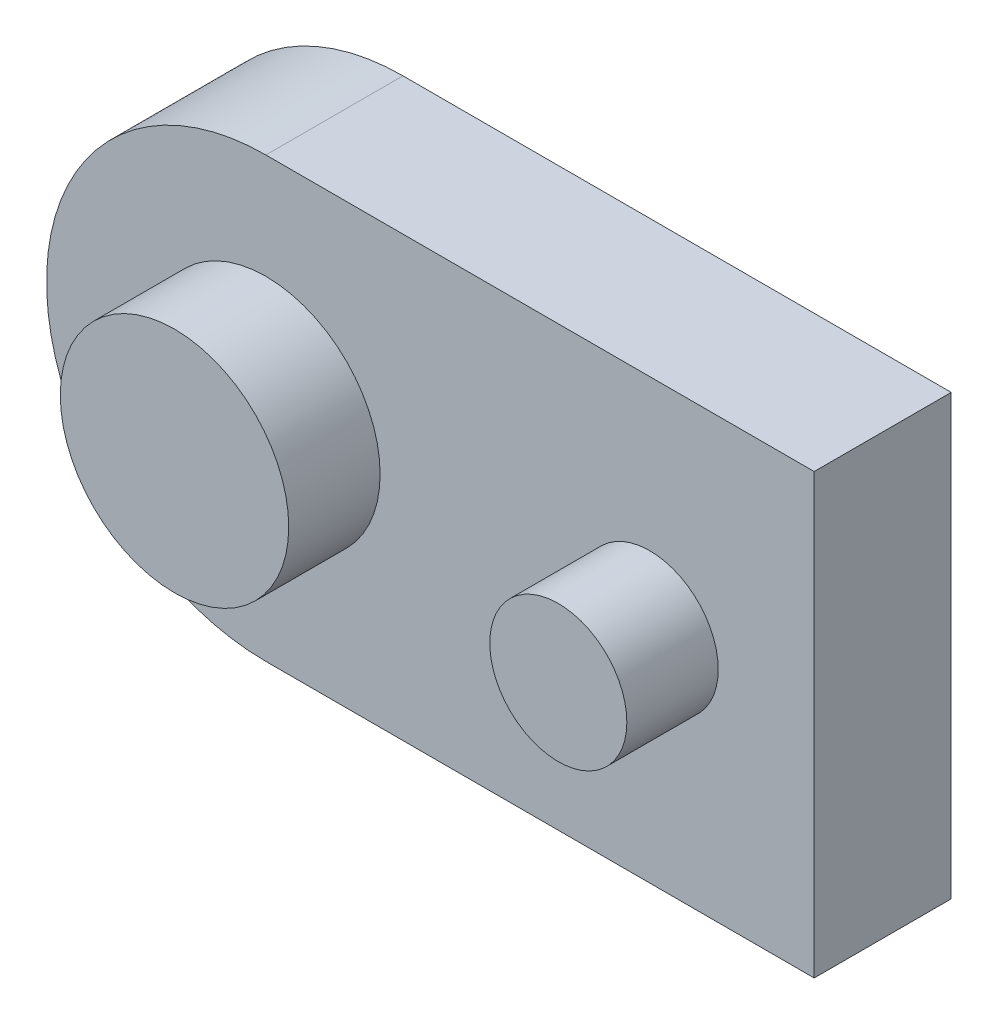
ISO-10303-21;
HEADER;
FILE_DESCRIPTION(('STEP AP214'),'2;1');
FILE_NAME('part.step','',(''),(''),'','','');
FILE_SCHEMA(('AUTOMOTIVE_DESIGN { 1 0 10303 214 1 1 1 1 }'));
ENDSEC;
DATA;
#1=APPLICATION_CONTEXT('core data for automotive mechanical design processes');
#2=APPLICATION_PROTOCOL_DEFINITION('international standard','automotive_design',2000,#1);
#3=PRODUCT_CONTEXT('',#1,'mechanical');
#4=PRODUCT('Part','Part','',(#3));
#5=PRODUCT_RELATED_PRODUCT_CATEGORY('part','',(#4));
#6=PRODUCT_DEFINITION_FORMATION('','',#4);
#7=PRODUCT_DEFINITION_CONTEXT('part definition',#1,'design');
#8=PRODUCT_DEFINITION('design','',#6,#7);
#9=PRODUCT_DEFINITION_SHAPE('','',#8);
#10=(LENGTH_UNIT() NAMED_UNIT(*) SI_UNIT(.MILLI.,.METRE.));
#11=(NAMED_UNIT(*) PLANE_ANGLE_UNIT() SI_UNIT($,.RADIAN.));
#12=(NAMED_UNIT(*) SI_UNIT($,.STERADIAN.) SOLID_ANGLE_UNIT());
#13=UNCERTAINTY_MEASURE_WITH_UNIT(LENGTH_MEASURE(1.E-05),#10,'distance_accuracy_value','');
#14=(GEOMETRIC_REPRESENTATION_CONTEXT(3) GLOBAL_UNCERTAINTY_ASSIGNED_CONTEXT((#13)) GLOBAL_UNIT_ASSIGNED_CONTEXT((#10,
#11,#12)) REPRESENTATION_CONTEXT('',''));
#15=CARTESIAN_POINT('',(0.,0.,0.));
#16=DIRECTION('',(0.,0.,1.));
#17=DIRECTION('',(1.,0.,0.));
#18=AXIS2_PLACEMENT_3D('',#15,#16,#17);
#19=CARTESIAN_POINT('',(0.,0.,3.));
#20=DIRECTION('',(0.,0.,-1.));
#21=DIRECTION('',(-1.,0.,0.));
#22=AXIS2_PLACEMENT_3D('',#19,#20,#21);
#23=CYLINDRICAL_SURFACE('',#22,4.8);
#24=CARTESIAN_POINT('',(0.,0.,0.));
#25=DIRECTION('',(0.,0.,1.));
#26=DIRECTION('',(1.,0.,0.));
#27=AXIS2_PLACEMENT_3D('',#24,#25,#26);
#28=CIRCLE('',#27,4.8);
#29=CARTESIAN_POINT('',(0.,4.8,0.));
#30=VERTEX_POINT('',#29);
#31=CARTESIAN_POINT('',(0.,-4.8,0.));
#32=VERTEX_POINT('',#31);
#33=EDGE_CURVE('E96',#30,#32,#28,.T.);
#34=ORIENTED_EDGE('',*,*,#33,.T.);
#35=DIRECTION('',(0.,0.,-1.));
#36=VECTOR('',#35,1.);
#37=CARTESIAN_POINT('',(0.,-4.8,3.));
#38=LINE('',#37,#36);
#39=CARTESIAN_POINT('',(0.,-4.8,3.));
#40=VERTEX_POINT('',#39);
#41=EDGE_CURVE('E11',#40,#32,#38,.T.);
#42=ORIENTED_EDGE('',*,*,#41,.F.);
#43=CARTESIAN_POINT('',(0.,0.,3.));
#44=DIRECTION('',(0.,0.,1.));
#45=DIRECTION('',(1.,0.,0.));
#46=AXIS2_PLACEMENT_3D('',#43,#44,#45);
#47=CIRCLE('',#46,4.8);
#48=CARTESIAN_POINT('',(0.,4.8,3.));
#49=VERTEX_POINT('',#48);
#50=EDGE_CURVE('E84',#49,#40,#47,.T.);
#51=ORIENTED_EDGE('',*,*,#50,.F.);
#52=DIRECTION('',(0.,0.,-1.));
#53=VECTOR('',#52,1.);
#54=CARTESIAN_POINT('',(0.,4.8,3.));
#55=LINE('',#54,#53);
#56=EDGE_CURVE('E92',#49,#30,#55,.T.);
#57=ORIENTED_EDGE('',*,*,#56,.T.);
#58=EDGE_LOOP('',(#34,#42,#51,#57));
#59=FACE_BOUND('',#58,.T.);
#60=ADVANCED_FACE('F33',(#59),#23,.T.);
#61=CARTESIAN_POINT('',(0.,-4.8,3.));
#62=DIRECTION('',(0.,1.,0.));
#63=DIRECTION('',(0.,0.,1.));
#64=AXIS2_PLACEMENT_3D('',#61,#62,#63);
#65=PLANE('',#64);
#66=DIRECTION('',(1.,0.,0.));
#67=VECTOR('',#66,1.);
#68=CARTESIAN_POINT('',(0.,-4.8,0.));
#69=LINE('',#68,#67);
#70=CARTESIAN_POINT('',(12.,-4.8,0.));
#71=VERTEX_POINT('',#70);
#72=EDGE_CURVE('E88',#32,#71,#69,.T.);
#73=ORIENTED_EDGE('',*,*,#72,.T.);
#74=DIRECTION('',(0.,0.,-1.));
#75=VECTOR('',#74,1.);
#76=CARTESIAN_POINT('',(12.,-4.8,3.));
#77=LINE('',#76,#75);
#78=CARTESIAN_POINT('',(12.,-4.8,3.));
#79=VERTEX_POINT('',#78);
#80=EDGE_CURVE('E41',#79,#71,#77,.T.);
#81=ORIENTED_EDGE('',*,*,#80,.F.);
#82=DIRECTION('',(1.,0.,0.));
#83=VECTOR('',#82,1.);
#84=CARTESIAN_POINT('',(0.,-4.8,3.));
#85=LINE('',#84,#83);
#86=EDGE_CURVE('E79',#40,#79,#85,.T.);
#87=ORIENTED_EDGE('',*,*,#86,.F.);
#88=ORIENTED_EDGE('',*,*,#41,.T.);
#89=EDGE_LOOP('',(#73,#81,#87,#88));
#90=FACE_BOUND('',#89,.T.);
#91=ADVANCED_FACE('F87',(#90),#65,.F.);
#92=CARTESIAN_POINT('',(12.,-4.8,3.));
#93=DIRECTION('',(-1.,0.,0.));
#94=DIRECTION('',(0.,0.,1.));
#95=AXIS2_PLACEMENT_3D('',#92,#93,#94);
#96=PLANE('',#95);
#97=DIRECTION('',(0.,1.,0.));
#98=VECTOR('',#97,1.);
#99=CARTESIAN_POINT('',(12.,-4.8,0.));
#100=LINE('',#99,#98);
#101=CARTESIAN_POINT('',(12.,4.8,0.));
#102=VERTEX_POINT('',#101);
#103=EDGE_CURVE('E66',#71,#102,#100,.T.);
#104=ORIENTED_EDGE('',*,*,#103,.T.);
#105=DIRECTION('',(0.,0.,-1.));
#106=VECTOR('',#105,1.);
#107=CARTESIAN_POINT('',(12.,4.8,3.));
#108=LINE('',#107,#106);
#109=CARTESIAN_POINT('',(12.,4.8,3.));
#110=VERTEX_POINT('',#109);
#111=EDGE_CURVE('E89',#110,#102,#108,.T.);
#112=ORIENTED_EDGE('',*,*,#111,.F.);
#113=DIRECTION('',(0.,1.,0.));
#114=VECTOR('',#113,1.);
#115=CARTESIAN_POINT('',(12.,-4.8,3.));
#116=LINE('',#115,#114);
#117=EDGE_CURVE('E82',#79,#110,#116,.T.);
#118=ORIENTED_EDGE('',*,*,#117,.F.);
#119=ORIENTED_EDGE('',*,*,#80,.T.);
#120=EDGE_LOOP('',(#104,#112,#118,#119));
#121=FACE_BOUND('',#120,.T.);
#122=ADVANCED_FACE('F90',(#121),#96,.F.);
#123=CARTESIAN_POINT('',(12.,4.8,3.));
#124=DIRECTION('',(0.,-1.,0.));
#125=DIRECTION('',(0.,0.,-1.));
#126=AXIS2_PLACEMENT_3D('',#123,#124,#125);
#127=PLANE('',#126);
#128=DIRECTION('',(-1.,0.,0.));
#129=VECTOR('',#128,1.);
#130=CARTESIAN_POINT('',(12.,4.8,0.));
#131=LINE('',#130,#129);
#132=EDGE_CURVE('E72',#102,#30,#131,.T.);
#133=ORIENTED_EDGE('',*,*,#132,.T.);
#134=ORIENTED_EDGE('',*,*,#56,.F.);
#135=DIRECTION('',(-1.,0.,0.));
#136=VECTOR('',#135,1.);
#137=CARTESIAN_POINT('',(12.,4.8,3.));
#138=LINE('',#137,#136);
#139=EDGE_CURVE('E49',#110,#49,#138,.T.);
#140=ORIENTED_EDGE('',*,*,#139,.F.);
#141=ORIENTED_EDGE('',*,*,#111,.T.);
#142=EDGE_LOOP('',(#133,#134,#140,#141));
#143=FACE_BOUND('',#142,.T.);
#144=ADVANCED_FACE('F104',(#143),#127,.F.);
#145=CARTESIAN_POINT('',(0.,0.,3.));
#146=DIRECTION('',(0.,0.,1.));
#147=DIRECTION('',(1.,0.,0.));
#148=AXIS2_PLACEMENT_3D('',#145,#146,#147);
#149=PLANE('',#148);
#150=CARTESIAN_POINT('',(0.,0.,3.));
#151=DIRECTION('',(0.,0.,1.));
#152=DIRECTION('',(1.,0.,0.));
#153=AXIS2_PLACEMENT_3D('',#150,#151,#152);
#154=CIRCLE('',#153,2.5);
#155=CARTESIAN_POINT('',(2.5,0.,3.));
#156=VERTEX_POINT('',#155);
#157=EDGE_CURVE('E115',#156,#156,#154,.F.);
#158=ORIENTED_EDGE('',*,*,#157,.T.);
#159=EDGE_LOOP('',(#158));
#160=FACE_BOUND('',#159,.T.);
#161=CARTESIAN_POINT('',(8.4,0.,3.));
#162=DIRECTION('',(0.,0.,1.));
#163=DIRECTION('',(1.,0.,0.));
#164=AXIS2_PLACEMENT_3D('',#161,#162,#163);
#165=CIRCLE('',#164,1.5);
#166=CARTESIAN_POINT('',(9.9,0.,3.));
#167=VERTEX_POINT('',#166);
#168=EDGE_CURVE('E99',#167,#167,#165,.F.);
#169=ORIENTED_EDGE('',*,*,#168,.T.);
#170=EDGE_LOOP('',(#169));
#171=FACE_BOUND('',#170,.T.);
#172=ORIENTED_EDGE('',*,*,#50,.T.);
#173=ORIENTED_EDGE('',*,*,#86,.T.);
#174=ORIENTED_EDGE('',*,*,#117,.T.);
#175=ORIENTED_EDGE('',*,*,#139,.T.);
#176=EDGE_LOOP('',(#172,#173,#174,#175));
#177=FACE_BOUND('',#176,.T.);
#178=ADVANCED_FACE('F80',(#160,#171,#177),#149,.T.);
#179=CARTESIAN_POINT('',(0.,0.,0.));
#180=DIRECTION('',(0.,0.,1.));
#181=DIRECTION('',(1.,0.,0.));
#182=AXIS2_PLACEMENT_3D('',#179,#180,#181);
#183=PLANE('',#182);
#184=ORIENTED_EDGE('',*,*,#33,.F.);
#185=ORIENTED_EDGE('',*,*,#132,.F.);
#186=ORIENTED_EDGE('',*,*,#103,.F.);
#187=ORIENTED_EDGE('',*,*,#72,.F.);
#188=EDGE_LOOP('',(#184,#185,#186,#187));
#189=FACE_BOUND('',#188,.T.);
#190=ADVANCED_FACE('F107',(#189),#183,.F.);
#191=CARTESIAN_POINT('',(8.4,0.,5.));
#192=DIRECTION('',(0.,0.,-1.));
#193=DIRECTION('',(-1.,0.,0.));
#194=AXIS2_PLACEMENT_3D('',#191,#192,#193);
#195=CYLINDRICAL_SURFACE('',#194,1.5);
#196=ORIENTED_EDGE('',*,*,#168,.F.);
#197=EDGE_LOOP('',(#196));
#198=FACE_BOUND('',#197,.T.);
#199=CARTESIAN_POINT('',(8.4,0.,5.));
#200=DIRECTION('',(0.,0.,1.));
#201=DIRECTION('',(1.,0.,0.));
#202=AXIS2_PLACEMENT_3D('',#199,#200,#201);
#203=CIRCLE('',#202,1.5);
#204=CARTESIAN_POINT('',(9.9,0.,5.));
#205=VERTEX_POINT('',#204);
#206=EDGE_CURVE('E112',#205,#205,#203,.T.);
#207=ORIENTED_EDGE('',*,*,#206,.F.);
#208=EDGE_LOOP('',(#207));
#209=FACE_BOUND('',#208,.T.);
#210=ADVANCED_FACE('F134',(#198,#209),#195,.T.);
#211=CARTESIAN_POINT('',(8.4,0.,5.));
#212=DIRECTION('',(0.,0.,1.));
#213=DIRECTION('',(1.,0.,0.));
#214=AXIS2_PLACEMENT_3D('',#211,#212,#213);
#215=PLANE('',#214);
#216=ORIENTED_EDGE('',*,*,#206,.T.);
#217=EDGE_LOOP('',(#216));
#218=FACE_BOUND('',#217,.T.);
#219=ADVANCED_FACE('F126',(#218),#215,.T.);
#220=CARTESIAN_POINT('',(0.,0.,5.));
#221=DIRECTION('',(0.,0.,-1.));
#222=DIRECTION('',(-1.,0.,0.));
#223=AXIS2_PLACEMENT_3D('',#220,#221,#222);
#224=CYLINDRICAL_SURFACE('',#223,2.5);
#225=ORIENTED_EDGE('',*,*,#157,.F.);
#226=EDGE_LOOP('',(#225));
#227=FACE_BOUND('',#226,.T.);
#228=CARTESIAN_POINT('',(0.,0.,5.));
#229=DIRECTION('',(0.,0.,1.));
#230=DIRECTION('',(1.,0.,0.));
#231=AXIS2_PLACEMENT_3D('',#228,#229,#230);
#232=CIRCLE('',#231,2.5);
#233=CARTESIAN_POINT('',(2.5,0.,5.));
#234=VERTEX_POINT('',#233);
#235=EDGE_CURVE('E118',#234,#234,#232,.T.);
#236=ORIENTED_EDGE('',*,*,#235,.F.);
#237=EDGE_LOOP('',(#236));
#238=FACE_BOUND('',#237,.T.);
#239=ADVANCED_FACE('F124',(#227,#238),#224,.T.);
#240=CARTESIAN_POINT('',(0.,0.,5.));
#241=DIRECTION('',(0.,0.,1.));
#242=DIRECTION('',(1.,0.,0.));
#243=AXIS2_PLACEMENT_3D('',#240,#241,#242);
#244=PLANE('',#243);
#245=ORIENTED_EDGE('',*,*,#235,.T.);
#246=EDGE_LOOP('',(#245));
#247=FACE_BOUND('',#246,.T.);
#248=ADVANCED_FACE('F122',(#247),#244,.T.);
#249=CLOSED_SHELL('',(#60,#91,#122,#144,#178,#190,#210,#219,#239,#248));
#250=MANIFOLD_SOLID_BREP('B2',#249);
#251=ADVANCED_BREP_SHAPE_REPRESENTATION('',(#18,#250),#14);
#252=SHAPE_DEFINITION_REPRESENTATION(#9,#251);
ENDSEC;
END-ISO-10303-21;
